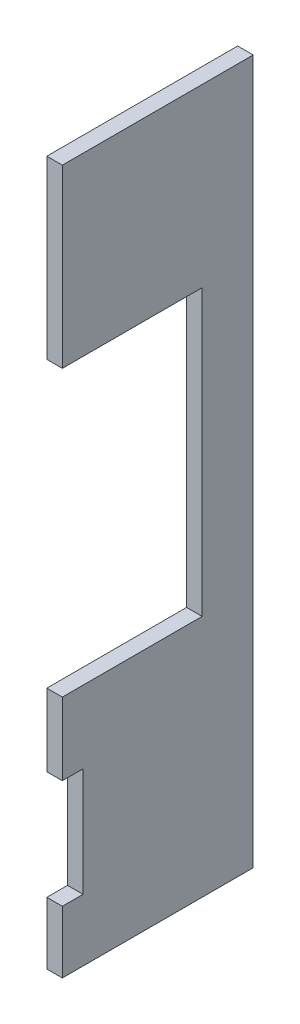
ISO-10303-21;
HEADER;
FILE_DESCRIPTION(('STEP AP214'),'2;1');
FILE_NAME('part.step','',(''),(''),'','','');
FILE_SCHEMA(('AUTOMOTIVE_DESIGN { 1 0 10303 214 1 1 1 1 }'));
ENDSEC;
DATA;
#1=APPLICATION_CONTEXT('core data for automotive mechanical design processes');
#2=APPLICATION_PROTOCOL_DEFINITION('international standard','automotive_design',2000,#1);
#3=PRODUCT_CONTEXT('',#1,'mechanical');
#4=PRODUCT('Part','Part','',(#3));
#5=PRODUCT_RELATED_PRODUCT_CATEGORY('part','',(#4));
#6=PRODUCT_DEFINITION_FORMATION('','',#4);
#7=PRODUCT_DEFINITION_CONTEXT('part definition',#1,'design');
#8=PRODUCT_DEFINITION('design','',#6,#7);
#9=PRODUCT_DEFINITION_SHAPE('','',#8);
#10=(LENGTH_UNIT() NAMED_UNIT(*) SI_UNIT(.MILLI.,.METRE.));
#11=(NAMED_UNIT(*) PLANE_ANGLE_UNIT() SI_UNIT($,.RADIAN.));
#12=(NAMED_UNIT(*) SI_UNIT($,.STERADIAN.) SOLID_ANGLE_UNIT());
#13=UNCERTAINTY_MEASURE_WITH_UNIT(LENGTH_MEASURE(1.E-05),#10,'distance_accuracy_value','');
#14=(GEOMETRIC_REPRESENTATION_CONTEXT(3) GLOBAL_UNCERTAINTY_ASSIGNED_CONTEXT((#13)) GLOBAL_UNIT_ASSIGNED_CONTEXT((#10,
#11,#12)) REPRESENTATION_CONTEXT('',''));
#15=CARTESIAN_POINT('',(0.,0.,0.));
#16=DIRECTION('',(0.,0.,1.));
#17=DIRECTION('',(1.,0.,0.));
#18=AXIS2_PLACEMENT_3D('',#15,#16,#17);
#19=CARTESIAN_POINT('',(-103.32,-116.114624464066,3.));
#20=DIRECTION('',(0.,1.,0.));
#21=DIRECTION('',(-1.,0.,0.));
#22=AXIS2_PLACEMENT_3D('',#19,#20,#21);
#23=PLANE('',#22);
#24=DIRECTION('',(1.,0.,0.));
#25=VECTOR('',#24,1.);
#26=CARTESIAN_POINT('',(-103.18593626287,-116.114624464066,-18.87));
#27=LINE('',#26,#25);
#28=CARTESIAN_POINT('',(-103.320000000001,-116.114624464066,-18.87));
#29=VERTEX_POINT('',#28);
#30=CARTESIAN_POINT('',(-100.32,-116.114624464066,-18.8699999999999));
#31=VERTEX_POINT('',#30);
#32=EDGE_CURVE('E1749',#29,#31,#27,.T.);
#33=ORIENTED_EDGE('',*,*,#32,.T.);
#34=DIRECTION('',(0.,0.,1.));
#35=VECTOR('',#34,1.);
#36=CARTESIAN_POINT('',(-100.32,-116.114624464066,3.));
#37=LINE('',#36,#35);
#38=CARTESIAN_POINT('',(-100.32,-116.114624464066,18.));
#39=VERTEX_POINT('',#38);
#40=EDGE_CURVE('E1735',#31,#39,#37,.T.);
#41=ORIENTED_EDGE('',*,*,#40,.T.);
#42=DIRECTION('',(1.,0.,0.));
#43=VECTOR('',#42,1.);
#44=CARTESIAN_POINT('',(-103.32,-116.114624464066,18.));
#45=LINE('',#44,#43);
#46=CARTESIAN_POINT('',(-103.32,-116.114624464066,18.));
#47=VERTEX_POINT('',#46);
#48=EDGE_CURVE('E1748',#47,#39,#45,.T.);
#49=ORIENTED_EDGE('',*,*,#48,.F.);
#50=DIRECTION('',(0.,0.,-1.));
#51=VECTOR('',#50,1.);
#52=CARTESIAN_POINT('',(-103.32,-116.114624464066,3.));
#53=LINE('',#52,#51);
#54=EDGE_CURVE('E1771',#47,#29,#53,.T.);
#55=ORIENTED_EDGE('',*,*,#54,.T.);
#56=EDGE_LOOP('',(#33,#41,#49,#55));
#57=FACE_BOUND('',#56,.T.);
#58=ADVANCED_FACE('F1642',(#57),#23,.F.);
#59=CARTESIAN_POINT('',(-103.32,19.8853755359338,-20.2264177019235));
#60=DIRECTION('',(0.,-1.,0.));
#61=DIRECTION('',(0.,0.,-1.));
#62=AXIS2_PLACEMENT_3D('',#59,#60,#61);
#63=PLANE('',#62);
#64=DIRECTION('',(0.,0.,1.));
#65=VECTOR('',#64,1.);
#66=CARTESIAN_POINT('',(-100.32,19.8853755359338,-175.));
#67=LINE('',#66,#65);
#68=CARTESIAN_POINT('',(-100.32,19.8853755359338,-18.87));
#69=VERTEX_POINT('',#68);
#70=CARTESIAN_POINT('',(-100.32,19.8853755359338,18.));
#71=VERTEX_POINT('',#70);
#72=EDGE_CURVE('E1769',#69,#71,#67,.T.);
#73=ORIENTED_EDGE('',*,*,#72,.F.);
#74=DIRECTION('',(1.,0.,0.));
#75=VECTOR('',#74,1.);
#76=CARTESIAN_POINT('',(0.,19.8853755359338,-18.87));
#77=LINE('',#76,#75);
#78=CARTESIAN_POINT('',(-103.32,19.8853755359338,-18.87));
#79=VERTEX_POINT('',#78);
#80=EDGE_CURVE('E1764',#79,#69,#77,.T.);
#81=ORIENTED_EDGE('',*,*,#80,.F.);
#82=DIRECTION('',(0.,0.,-1.));
#83=VECTOR('',#82,1.);
#84=CARTESIAN_POINT('',(-103.32,19.8853755359338,3.));
#85=LINE('',#84,#83);
#86=CARTESIAN_POINT('',(-103.32,19.8853755359338,18.));
#87=VERTEX_POINT('',#86);
#88=EDGE_CURVE('E1773',#87,#79,#85,.T.);
#89=ORIENTED_EDGE('',*,*,#88,.F.);
#90=DIRECTION('',(1.,0.,0.));
#91=VECTOR('',#90,1.);
#92=CARTESIAN_POINT('',(-182.32,19.8853755359338,18.));
#93=LINE('',#92,#91);
#94=EDGE_CURVE('E1750',#87,#71,#93,.T.);
#95=ORIENTED_EDGE('',*,*,#94,.T.);
#96=EDGE_LOOP('',(#73,#81,#89,#95));
#97=FACE_BOUND('',#96,.T.);
#98=ADVANCED_FACE('F1827',(#97),#63,.F.);
#99=CARTESIAN_POINT('',(-116.140375406953,22.8853755359338,18.));
#100=DIRECTION('',(0.,0.,-1.));
#101=DIRECTION('',(-1.,0.,0.));
#102=AXIS2_PLACEMENT_3D('',#99,#100,#101);
#103=PLANE('',#102);
#104=ORIENTED_EDGE('',*,*,#94,.F.);
#105=DIRECTION('',(0.,-1.,0.));
#106=VECTOR('',#105,1.);
#107=CARTESIAN_POINT('',(-103.32,19.8853755359338,18.));
#108=LINE('',#107,#106);
#109=CARTESIAN_POINT('',(-103.32,-14.1146244640659,18.));
#110=VERTEX_POINT('',#109);
#111=EDGE_CURVE('E1759',#87,#110,#108,.T.);
#112=ORIENTED_EDGE('',*,*,#111,.T.);
#113=DIRECTION('',(-1.,0.,0.));
#114=VECTOR('',#113,1.);
#115=CARTESIAN_POINT('',(-100.32,-14.1146244640659,18.));
#116=LINE('',#115,#114);
#117=CARTESIAN_POINT('',(-100.32,-14.1146244640659,18.));
#118=VERTEX_POINT('',#117);
#119=EDGE_CURVE('E1866',#118,#110,#116,.T.);
#120=ORIENTED_EDGE('',*,*,#119,.F.);
#121=DIRECTION('',(0.,-1.,0.));
#122=VECTOR('',#121,1.);
#123=CARTESIAN_POINT('',(-100.32,-113.114624464066,18.));
#124=LINE('',#123,#122);
#125=EDGE_CURVE('E1744',#71,#118,#124,.T.);
#126=ORIENTED_EDGE('',*,*,#125,.F.);
#127=EDGE_LOOP('',(#104,#112,#120,#126));
#128=FACE_BOUND('',#127,.T.);
#129=ADVANCED_FACE('F1823',(#128),#103,.F.);
#130=CARTESIAN_POINT('',(-100.32,22.8853755359338,-18.87));
#131=DIRECTION('',(-1.,0.,0.));
#132=DIRECTION('',(0.,-1.,0.));
#133=AXIS2_PLACEMENT_3D('',#130,#131,#132);
#134=PLANE('',#133);
#135=ORIENTED_EDGE('',*,*,#72,.T.);
#136=ORIENTED_EDGE('',*,*,#125,.T.);
#137=DIRECTION('',(0.,0.,-1.));
#138=VECTOR('',#137,1.);
#139=CARTESIAN_POINT('',(-100.32,-14.1146244640659,18.));
#140=LINE('',#139,#138);
#141=CARTESIAN_POINT('',(-100.32,-14.1146244640659,-9.));
#142=VERTEX_POINT('',#141);
#143=EDGE_CURVE('E1876',#118,#142,#140,.T.);
#144=ORIENTED_EDGE('',*,*,#143,.T.);
#145=DIRECTION('',(0.,-1.,0.));
#146=VECTOR('',#145,1.);
#147=CARTESIAN_POINT('',(-100.32,-14.1146244640659,-9.));
#148=LINE('',#147,#146);
#149=CARTESIAN_POINT('',(-100.32,-69.1146244640659,-9.));
#150=VERTEX_POINT('',#149);
#151=EDGE_CURVE('E1867',#142,#150,#148,.T.);
#152=ORIENTED_EDGE('',*,*,#151,.T.);
#153=DIRECTION('',(0.,0.,1.));
#154=VECTOR('',#153,1.);
#155=CARTESIAN_POINT('',(-100.32,-69.1146244640659,-9.));
#156=LINE('',#155,#154);
#157=CARTESIAN_POINT('',(-100.32,-69.1146244640659,18.));
#158=VERTEX_POINT('',#157);
#159=EDGE_CURVE('E1885',#150,#158,#156,.T.);
#160=ORIENTED_EDGE('',*,*,#159,.T.);
#161=CARTESIAN_POINT('',(-100.32,-83.1146244640659,18.));
#162=VERTEX_POINT('',#161);
#163=EDGE_CURVE('E1741',#158,#162,#124,.T.);
#164=ORIENTED_EDGE('',*,*,#163,.T.);
#165=DIRECTION('',(0.,0.,-1.));
#166=VECTOR('',#165,1.);
#167=CARTESIAN_POINT('',(-100.320000000002,-83.1146244640659,-18.87));
#168=LINE('',#167,#166);
#169=CARTESIAN_POINT('',(-100.320000000002,-83.1146244640659,14.));
#170=VERTEX_POINT('',#169);
#171=EDGE_CURVE('E1789',#162,#170,#168,.T.);
#172=ORIENTED_EDGE('',*,*,#171,.T.);
#173=DIRECTION('',(0.,-1.,0.));
#174=VECTOR('',#173,1.);
#175=CARTESIAN_POINT('',(-100.32,22.8853755359338,14.));
#176=LINE('',#175,#174);
#177=CARTESIAN_POINT('',(-100.320000000002,-104.114624464066,14.));
#178=VERTEX_POINT('',#177);
#179=EDGE_CURVE('E1742',#170,#178,#176,.T.);
#180=ORIENTED_EDGE('',*,*,#179,.T.);
#181=DIRECTION('',(0.,0.,1.));
#182=VECTOR('',#181,1.);
#183=CARTESIAN_POINT('',(-100.320000000002,-104.114624464066,-18.87));
#184=LINE('',#183,#182);
#185=CARTESIAN_POINT('',(-100.32,-104.114624464066,18.));
#186=VERTEX_POINT('',#185);
#187=EDGE_CURVE('E1738',#178,#186,#184,.T.);
#188=ORIENTED_EDGE('',*,*,#187,.T.);
#189=EDGE_CURVE('E1732',#186,#39,#124,.T.);
#190=ORIENTED_EDGE('',*,*,#189,.T.);
#191=ORIENTED_EDGE('',*,*,#40,.F.);
#192=DIRECTION('',(0.,1.,0.));
#193=VECTOR('',#192,1.);
#194=CARTESIAN_POINT('',(-100.32,-116.114624464066,-18.87));
#195=LINE('',#194,#193);
#196=EDGE_CURVE('E1657',#31,#69,#195,.T.);
#197=ORIENTED_EDGE('',*,*,#196,.T.);
#198=EDGE_LOOP('',(#135,#136,#144,#152,#160,#164,#172,#180,#188,#190,#191,#197));
#199=FACE_BOUND('',#198,.T.);
#200=ADVANCED_FACE('F1734',(#199),#134,.F.);
#201=ORIENTED_EDGE('',*,*,#48,.T.);
#202=ORIENTED_EDGE('',*,*,#189,.F.);
#203=DIRECTION('',(-1.,0.,0.));
#204=VECTOR('',#203,1.);
#205=CARTESIAN_POINT('',(-116.140375406953,-104.114624464066,18.));
#206=LINE('',#205,#204);
#207=CARTESIAN_POINT('',(-103.32,-104.114624464066,18.));
#208=VERTEX_POINT('',#207);
#209=EDGE_CURVE('E13',#186,#208,#206,.T.);
#210=ORIENTED_EDGE('',*,*,#209,.T.);
#211=EDGE_CURVE('E1754',#208,#47,#108,.T.);
#212=ORIENTED_EDGE('',*,*,#211,.T.);
#213=EDGE_LOOP('',(#201,#202,#210,#212));
#214=FACE_BOUND('',#213,.T.);
#215=ADVANCED_FACE('F1752',(#214),#103,.F.);
#216=CARTESIAN_POINT('',(-103.32,-100.114624464066,3.));
#217=DIRECTION('',(1.,0.,0.));
#218=DIRECTION('',(0.,0.,-1.));
#219=AXIS2_PLACEMENT_3D('',#216,#217,#218);
#220=PLANE('',#219);
#221=DIRECTION('',(0.,-1.,0.));
#222=VECTOR('',#221,1.);
#223=CARTESIAN_POINT('',(-103.32,-14.1146244640659,-9.));
#224=LINE('',#223,#222);
#225=CARTESIAN_POINT('',(-103.32,-14.1146244640659,-9.));
#226=VERTEX_POINT('',#225);
#227=CARTESIAN_POINT('',(-103.32,-69.1146244640659,-9.));
#228=VERTEX_POINT('',#227);
#229=EDGE_CURVE('E1870',#226,#228,#224,.T.);
#230=ORIENTED_EDGE('',*,*,#229,.F.);
#231=DIRECTION('',(0.,0.,-1.));
#232=VECTOR('',#231,1.);
#233=CARTESIAN_POINT('',(-103.32,-14.1146244640659,18.));
#234=LINE('',#233,#232);
#235=EDGE_CURVE('E1862',#110,#226,#234,.T.);
#236=ORIENTED_EDGE('',*,*,#235,.F.);
#237=ORIENTED_EDGE('',*,*,#111,.F.);
#238=ORIENTED_EDGE('',*,*,#88,.T.);
#239=DIRECTION('',(0.,-1.,0.));
#240=VECTOR('',#239,1.);
#241=CARTESIAN_POINT('',(-103.32,22.8853755359338,-18.87));
#242=LINE('',#241,#240);
#243=EDGE_CURVE('E1767',#79,#29,#242,.T.);
#244=ORIENTED_EDGE('',*,*,#243,.T.);
#245=ORIENTED_EDGE('',*,*,#54,.F.);
#246=ORIENTED_EDGE('',*,*,#211,.F.);
#247=DIRECTION('',(0.,0.,1.));
#248=VECTOR('',#247,1.);
#249=CARTESIAN_POINT('',(-103.32,-104.114624464066,14.));
#250=LINE('',#249,#248);
#251=CARTESIAN_POINT('',(-103.32,-104.114624464066,14.));
#252=VERTEX_POINT('',#251);
#253=EDGE_CURVE('E1795',#252,#208,#250,.T.);
#254=ORIENTED_EDGE('',*,*,#253,.F.);
#255=DIRECTION('',(0.,-1.,0.));
#256=VECTOR('',#255,1.);
#257=CARTESIAN_POINT('',(-103.32,-83.1146244640659,14.));
#258=LINE('',#257,#256);
#259=CARTESIAN_POINT('',(-103.32,-83.1146244640659,14.));
#260=VERTEX_POINT('',#259);
#261=EDGE_CURVE('E1794',#260,#252,#258,.T.);
#262=ORIENTED_EDGE('',*,*,#261,.F.);
#263=DIRECTION('',(0.,0.,-1.));
#264=VECTOR('',#263,1.);
#265=CARTESIAN_POINT('',(-103.32,-83.1146244640659,18.));
#266=LINE('',#265,#264);
#267=CARTESIAN_POINT('',(-103.32,-83.1146244640659,18.));
#268=VERTEX_POINT('',#267);
#269=EDGE_CURVE('E1786',#268,#260,#266,.T.);
#270=ORIENTED_EDGE('',*,*,#269,.F.);
#271=CARTESIAN_POINT('',(-103.32,-69.1146244640659,18.));
#272=VERTEX_POINT('',#271);
#273=EDGE_CURVE('E1757',#272,#268,#108,.T.);
#274=ORIENTED_EDGE('',*,*,#273,.F.);
#275=DIRECTION('',(0.,0.,1.));
#276=VECTOR('',#275,1.);
#277=CARTESIAN_POINT('',(-103.32,-69.1146244640659,-9.));
#278=LINE('',#277,#276);
#279=EDGE_CURVE('E1665',#228,#272,#278,.T.);
#280=ORIENTED_EDGE('',*,*,#279,.F.);
#281=EDGE_LOOP('',(#230,#236,#237,#238,#244,#245,#246,#254,#262,#270,#274,#280));
#282=FACE_BOUND('',#281,.T.);
#283=ADVANCED_FACE('F1644',(#282),#220,.F.);
#284=CARTESIAN_POINT('',(0.,0.,-18.87));
#285=DIRECTION('',(0.,0.,1.));
#286=DIRECTION('',(1.,0.,0.));
#287=AXIS2_PLACEMENT_3D('',#284,#285,#286);
#288=PLANE('',#287);
#289=ORIENTED_EDGE('',*,*,#196,.F.);
#290=ORIENTED_EDGE('',*,*,#32,.F.);
#291=ORIENTED_EDGE('',*,*,#243,.F.);
#292=ORIENTED_EDGE('',*,*,#80,.T.);
#293=EDGE_LOOP('',(#289,#290,#291,#292));
#294=FACE_BOUND('',#293,.T.);
#295=ADVANCED_FACE('F1815',(#294),#288,.F.);
#296=ORIENTED_EDGE('',*,*,#163,.F.);
#297=DIRECTION('',(-1.,0.,0.));
#298=VECTOR('',#297,1.);
#299=CARTESIAN_POINT('',(-100.32,-69.1146244640659,18.));
#300=LINE('',#299,#298);
#301=EDGE_CURVE('E1881',#158,#272,#300,.T.);
#302=ORIENTED_EDGE('',*,*,#301,.T.);
#303=ORIENTED_EDGE('',*,*,#273,.T.);
#304=DIRECTION('',(1.,0.,0.));
#305=VECTOR('',#304,1.);
#306=CARTESIAN_POINT('',(-116.140375406953,-83.1146244640659,18.));
#307=LINE('',#306,#305);
#308=EDGE_CURVE('E1650',#268,#162,#307,.T.);
#309=ORIENTED_EDGE('',*,*,#308,.T.);
#310=EDGE_LOOP('',(#296,#302,#303,#309));
#311=FACE_BOUND('',#310,.T.);
#312=ADVANCED_FACE('F1778',(#311),#103,.F.);
#313=CARTESIAN_POINT('',(41.68,-83.1146244640659,14.));
#314=DIRECTION('',(0.,0.,-1.));
#315=DIRECTION('',(0.,1.,0.));
#316=AXIS2_PLACEMENT_3D('',#313,#314,#315);
#317=PLANE('',#316);
#318=DIRECTION('',(-1.,0.,0.));
#319=VECTOR('',#318,1.);
#320=CARTESIAN_POINT('',(41.68,-83.1146244640659,14.));
#321=LINE('',#320,#319);
#322=EDGE_CURVE('E1797',#170,#260,#321,.T.);
#323=ORIENTED_EDGE('',*,*,#322,.T.);
#324=ORIENTED_EDGE('',*,*,#261,.T.);
#325=DIRECTION('',(-1.,0.,0.));
#326=VECTOR('',#325,1.);
#327=CARTESIAN_POINT('',(41.68,-104.114624464066,14.));
#328=LINE('',#327,#326);
#329=EDGE_CURVE('E1803',#178,#252,#328,.T.);
#330=ORIENTED_EDGE('',*,*,#329,.F.);
#331=ORIENTED_EDGE('',*,*,#179,.F.);
#332=EDGE_LOOP('',(#323,#324,#330,#331));
#333=FACE_BOUND('',#332,.T.);
#334=ADVANCED_FACE('F1809',(#333),#317,.F.);
#335=CARTESIAN_POINT('',(41.68,-104.114624464066,14.));
#336=DIRECTION('',(0.,-1.,0.));
#337=DIRECTION('',(0.,0.,-1.));
#338=AXIS2_PLACEMENT_3D('',#335,#336,#337);
#339=PLANE('',#338);
#340=ORIENTED_EDGE('',*,*,#329,.T.);
#341=ORIENTED_EDGE('',*,*,#253,.T.);
#342=ORIENTED_EDGE('',*,*,#209,.F.);
#343=ORIENTED_EDGE('',*,*,#187,.F.);
#344=EDGE_LOOP('',(#340,#341,#342,#343));
#345=FACE_BOUND('',#344,.T.);
#346=ADVANCED_FACE('F1811',(#345),#339,.F.);
#347=CARTESIAN_POINT('',(41.68,-83.1146244640659,18.));
#348=DIRECTION('',(0.,1.,0.));
#349=DIRECTION('',(0.,0.,1.));
#350=AXIS2_PLACEMENT_3D('',#347,#348,#349);
#351=PLANE('',#350);
#352=ORIENTED_EDGE('',*,*,#308,.F.);
#353=ORIENTED_EDGE('',*,*,#269,.T.);
#354=ORIENTED_EDGE('',*,*,#322,.F.);
#355=ORIENTED_EDGE('',*,*,#171,.F.);
#356=EDGE_LOOP('',(#352,#353,#354,#355));
#357=FACE_BOUND('',#356,.T.);
#358=ADVANCED_FACE('F1784',(#357),#351,.F.);
#359=CARTESIAN_POINT('',(-100.32,-14.1146244640659,-9.));
#360=DIRECTION('',(0.,0.,-1.));
#361=DIRECTION('',(-1.,0.,0.));
#362=AXIS2_PLACEMENT_3D('',#359,#360,#361);
#363=PLANE('',#362);
#364=ORIENTED_EDGE('',*,*,#229,.T.);
#365=DIRECTION('',(-1.,0.,0.));
#366=VECTOR('',#365,1.);
#367=CARTESIAN_POINT('',(-100.32,-69.1146244640659,-9.));
#368=LINE('',#367,#366);
#369=EDGE_CURVE('E1882',#150,#228,#368,.T.);
#370=ORIENTED_EDGE('',*,*,#369,.F.);
#371=ORIENTED_EDGE('',*,*,#151,.F.);
#372=DIRECTION('',(-1.,0.,0.));
#373=VECTOR('',#372,1.);
#374=CARTESIAN_POINT('',(-100.32,-14.1146244640659,-9.));
#375=LINE('',#374,#373);
#376=EDGE_CURVE('E1799',#142,#226,#375,.T.);
#377=ORIENTED_EDGE('',*,*,#376,.T.);
#378=EDGE_LOOP('',(#364,#370,#371,#377));
#379=FACE_BOUND('',#378,.T.);
#380=ADVANCED_FACE('F1846',(#379),#363,.F.);
#381=CARTESIAN_POINT('',(-100.32,-14.1146244640659,18.));
#382=DIRECTION('',(0.,1.,0.));
#383=DIRECTION('',(0.,0.,1.));
#384=AXIS2_PLACEMENT_3D('',#381,#382,#383);
#385=PLANE('',#384);
#386=ORIENTED_EDGE('',*,*,#235,.T.);
#387=ORIENTED_EDGE('',*,*,#376,.F.);
#388=ORIENTED_EDGE('',*,*,#143,.F.);
#389=ORIENTED_EDGE('',*,*,#119,.T.);
#390=EDGE_LOOP('',(#386,#387,#388,#389));
#391=FACE_BOUND('',#390,.T.);
#392=ADVANCED_FACE('F1851',(#391),#385,.F.);
#393=CARTESIAN_POINT('',(-100.32,-69.1146244640659,-9.));
#394=DIRECTION('',(0.,-1.,0.));
#395=DIRECTION('',(0.,0.,-1.));
#396=AXIS2_PLACEMENT_3D('',#393,#394,#395);
#397=PLANE('',#396);
#398=ORIENTED_EDGE('',*,*,#279,.T.);
#399=ORIENTED_EDGE('',*,*,#301,.F.);
#400=ORIENTED_EDGE('',*,*,#159,.F.);
#401=ORIENTED_EDGE('',*,*,#369,.T.);
#402=EDGE_LOOP('',(#398,#399,#400,#401));
#403=FACE_BOUND('',#402,.T.);
#404=ADVANCED_FACE('F1853',(#403),#397,.F.);
#405=CLOSED_SHELL('',(#58,#98,#129,#200,#215,#283,#295,#312,#334,#346,#358,#380,#392,#404));
#406=MANIFOLD_SOLID_BREP('B2',#405);
#407=ADVANCED_BREP_SHAPE_REPRESENTATION('',(#18,#406),#14);
#408=SHAPE_DEFINITION_REPRESENTATION(#9,#407);
ENDSEC;
END-ISO-10303-21;
